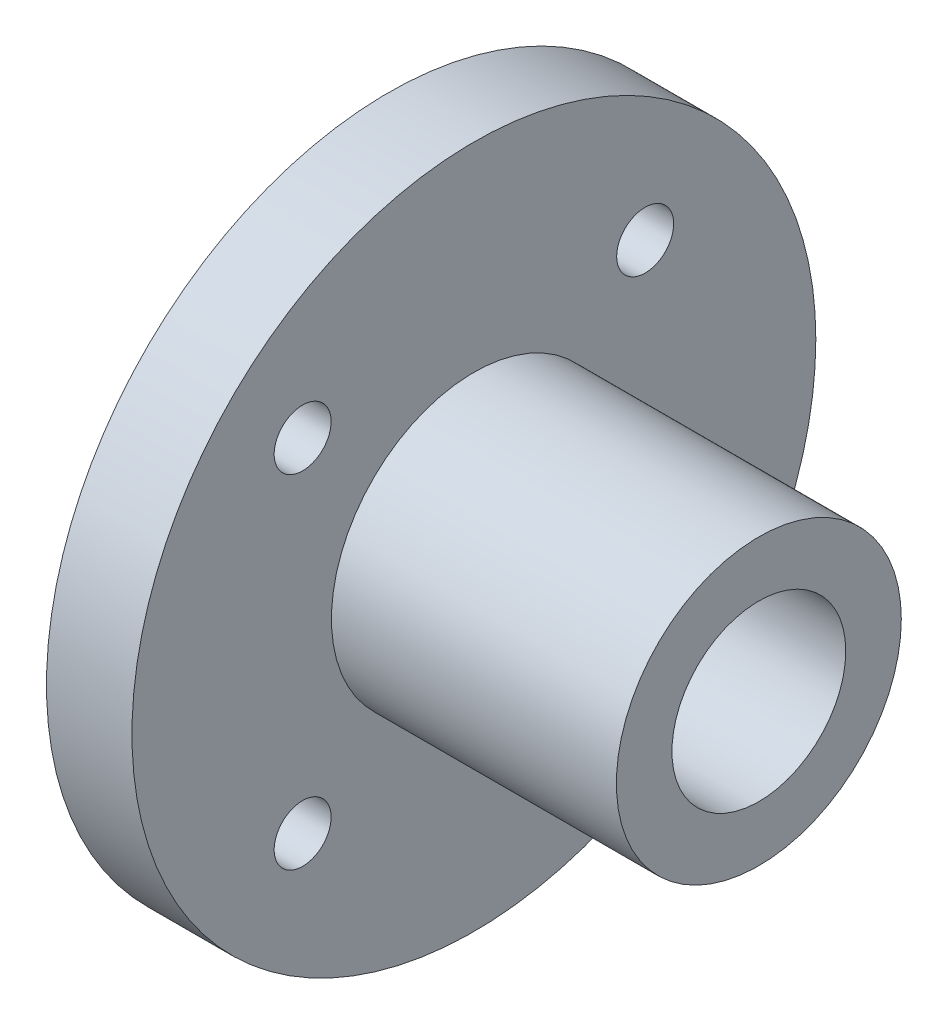
ISO-10303-21;
HEADER;
FILE_DESCRIPTION(('STEP AP214'),'2;1');
FILE_NAME('part.step','',(''),(''),'','','');
FILE_SCHEMA(('AUTOMOTIVE_DESIGN { 1 0 10303 214 1 1 1 1 }'));
ENDSEC;
DATA;
#1=APPLICATION_CONTEXT('core data for automotive mechanical design processes');
#2=APPLICATION_PROTOCOL_DEFINITION('international standard','automotive_design',2000,#1);
#3=PRODUCT_CONTEXT('',#1,'mechanical');
#4=PRODUCT('Part','Part','',(#3));
#5=PRODUCT_RELATED_PRODUCT_CATEGORY('part','',(#4));
#6=PRODUCT_DEFINITION_FORMATION('','',#4);
#7=PRODUCT_DEFINITION_CONTEXT('part definition',#1,'design');
#8=PRODUCT_DEFINITION('design','',#6,#7);
#9=PRODUCT_DEFINITION_SHAPE('','',#8);
#10=(LENGTH_UNIT() NAMED_UNIT(*) SI_UNIT(.MILLI.,.METRE.));
#11=(NAMED_UNIT(*) PLANE_ANGLE_UNIT() SI_UNIT($,.RADIAN.));
#12=(NAMED_UNIT(*) SI_UNIT($,.STERADIAN.) SOLID_ANGLE_UNIT());
#13=UNCERTAINTY_MEASURE_WITH_UNIT(LENGTH_MEASURE(1.E-05),#10,'distance_accuracy_value','');
#14=(GEOMETRIC_REPRESENTATION_CONTEXT(3) GLOBAL_UNCERTAINTY_ASSIGNED_CONTEXT((#13)) GLOBAL_UNIT_ASSIGNED_CONTEXT((#10,
#11,#12)) REPRESENTATION_CONTEXT('',''));
#15=CARTESIAN_POINT('',(0.,0.,0.));
#16=DIRECTION('',(0.,0.,1.));
#17=DIRECTION('',(1.,0.,0.));
#18=AXIS2_PLACEMENT_3D('',#15,#16,#17);
#19=CARTESIAN_POINT('',(-3.,0.,0.));
#20=DIRECTION('',(1.,0.,0.));
#21=DIRECTION('',(0.,0.,-1.));
#22=AXIS2_PLACEMENT_3D('',#19,#20,#21);
#23=CYLINDRICAL_SURFACE('',#22,12.);
#24=CARTESIAN_POINT('',(-3.,0.,0.));
#25=DIRECTION('',(1.,0.,0.));
#26=DIRECTION('',(0.,0.,-1.));
#27=AXIS2_PLACEMENT_3D('',#24,#25,#26);
#28=CIRCLE('',#27,12.);
#29=CARTESIAN_POINT('',(-3.,0.,-12.));
#30=VERTEX_POINT('',#29);
#31=EDGE_CURVE('E55',#30,#30,#28,.T.);
#32=ORIENTED_EDGE('',*,*,#31,.T.);
#33=EDGE_LOOP('',(#32));
#34=FACE_BOUND('',#33,.T.);
#35=CARTESIAN_POINT('',(0.,0.,0.));
#36=DIRECTION('',(1.,0.,0.));
#37=DIRECTION('',(0.,0.,-1.));
#38=AXIS2_PLACEMENT_3D('',#35,#36,#37);
#39=CIRCLE('',#38,12.);
#40=CARTESIAN_POINT('',(0.,0.,-12.));
#41=VERTEX_POINT('',#40);
#42=EDGE_CURVE('E60',#41,#41,#39,.T.);
#43=ORIENTED_EDGE('',*,*,#42,.F.);
#44=EDGE_LOOP('',(#43));
#45=FACE_BOUND('',#44,.T.);
#46=ADVANCED_FACE('F44',(#34,#45),#23,.T.);
#47=CARTESIAN_POINT('',(-3.,0.,0.));
#48=DIRECTION('',(1.,0.,0.));
#49=DIRECTION('',(0.,0.,-1.));
#50=AXIS2_PLACEMENT_3D('',#47,#48,#49);
#51=PLANE('',#50);
#52=CARTESIAN_POINT('',(-3.,-6.01040764008565,-6.01040764008565));
#53=DIRECTION('',(-1.,0.,0.));
#54=DIRECTION('',(0.,0.,1.));
#55=AXIS2_PLACEMENT_3D('',#52,#53,#54);
#56=CIRCLE('',#55,1.);
#57=CARTESIAN_POINT('',(-3.,-6.01040764008565,-5.01040764008565));
#58=VERTEX_POINT('',#57);
#59=EDGE_CURVE('E90',#58,#58,#56,.T.);
#60=ORIENTED_EDGE('',*,*,#59,.F.);
#61=EDGE_LOOP('',(#60));
#62=FACE_BOUND('',#61,.T.);
#63=CARTESIAN_POINT('',(-3.,6.01040764008565,6.01040764008566));
#64=DIRECTION('',(-1.,0.,0.));
#65=DIRECTION('',(0.,0.,1.));
#66=AXIS2_PLACEMENT_3D('',#63,#64,#65);
#67=CIRCLE('',#66,1.);
#68=CARTESIAN_POINT('',(-3.,6.01040764008565,7.01040764008566));
#69=VERTEX_POINT('',#68);
#70=EDGE_CURVE('E89',#69,#69,#67,.T.);
#71=ORIENTED_EDGE('',*,*,#70,.F.);
#72=EDGE_LOOP('',(#71));
#73=FACE_BOUND('',#72,.T.);
#74=CARTESIAN_POINT('',(-3.,-6.01040764008565,6.01040764008565));
#75=DIRECTION('',(-1.,0.,0.));
#76=DIRECTION('',(0.,0.,1.));
#77=AXIS2_PLACEMENT_3D('',#74,#75,#76);
#78=CIRCLE('',#77,1.);
#79=CARTESIAN_POINT('',(-3.,-6.01040764008565,7.01040764008565));
#80=VERTEX_POINT('',#79);
#81=EDGE_CURVE('E91',#80,#80,#78,.T.);
#82=ORIENTED_EDGE('',*,*,#81,.F.);
#83=EDGE_LOOP('',(#82));
#84=FACE_BOUND('',#83,.T.);
#85=CARTESIAN_POINT('',(-3.,6.01040764008566,-6.01040764008565));
#86=DIRECTION('',(-1.,0.,0.));
#87=DIRECTION('',(0.,0.,1.));
#88=AXIS2_PLACEMENT_3D('',#85,#86,#87);
#89=CIRCLE('',#88,1.);
#90=CARTESIAN_POINT('',(-3.,6.01040764008566,-5.01040764008565));
#91=VERTEX_POINT('',#90);
#92=EDGE_CURVE('E75',#91,#91,#89,.T.);
#93=ORIENTED_EDGE('',*,*,#92,.F.);
#94=EDGE_LOOP('',(#93));
#95=FACE_BOUND('',#94,.T.);
#96=CARTESIAN_POINT('',(-3.,0.,0.));
#97=DIRECTION('',(1.,0.,0.));
#98=DIRECTION('',(0.,0.,-1.));
#99=AXIS2_PLACEMENT_3D('',#96,#97,#98);
#100=CIRCLE('',#99,3.05);
#101=CARTESIAN_POINT('',(-3.,0.,-3.05));
#102=VERTEX_POINT('',#101);
#103=EDGE_CURVE('E65',#102,#102,#100,.T.);
#104=ORIENTED_EDGE('',*,*,#103,.T.);
#105=EDGE_LOOP('',(#104));
#106=FACE_BOUND('',#105,.T.);
#107=ORIENTED_EDGE('',*,*,#31,.F.);
#108=EDGE_LOOP('',(#107));
#109=FACE_BOUND('',#108,.T.);
#110=ADVANCED_FACE('F101',(#62,#73,#84,#95,#106,#109),#51,.F.);
#111=CARTESIAN_POINT('',(0.,0.,0.));
#112=DIRECTION('',(1.,0.,0.));
#113=DIRECTION('',(0.,0.,-1.));
#114=AXIS2_PLACEMENT_3D('',#111,#112,#113);
#115=PLANE('',#114);
#116=CARTESIAN_POINT('',(0.,-6.01040764008565,-6.01040764008565));
#117=DIRECTION('',(1.,0.,0.));
#118=DIRECTION('',(0.,0.,-1.));
#119=AXIS2_PLACEMENT_3D('',#116,#117,#118);
#120=CIRCLE('',#119,1.);
#121=CARTESIAN_POINT('',(0.,-6.01040764008565,-7.01040764008565));
#122=VERTEX_POINT('',#121);
#123=EDGE_CURVE('E48',#122,#122,#120,.T.);
#124=ORIENTED_EDGE('',*,*,#123,.F.);
#125=EDGE_LOOP('',(#124));
#126=FACE_BOUND('',#125,.T.);
#127=CARTESIAN_POINT('',(0.,6.01040764008565,6.01040764008566));
#128=DIRECTION('',(1.,0.,0.));
#129=DIRECTION('',(0.,0.,-1.));
#130=AXIS2_PLACEMENT_3D('',#127,#128,#129);
#131=CIRCLE('',#130,1.);
#132=CARTESIAN_POINT('',(0.,6.01040764008565,5.01040764008566));
#133=VERTEX_POINT('',#132);
#134=EDGE_CURVE('E74',#133,#133,#131,.T.);
#135=ORIENTED_EDGE('',*,*,#134,.F.);
#136=EDGE_LOOP('',(#135));
#137=FACE_BOUND('',#136,.T.);
#138=CARTESIAN_POINT('',(0.,-6.01040764008565,6.01040764008565));
#139=DIRECTION('',(1.,0.,0.));
#140=DIRECTION('',(0.,0.,-1.));
#141=AXIS2_PLACEMENT_3D('',#138,#139,#140);
#142=CIRCLE('',#141,1.);
#143=CARTESIAN_POINT('',(0.,-6.01040764008565,5.01040764008565));
#144=VERTEX_POINT('',#143);
#145=EDGE_CURVE('E72',#144,#144,#142,.T.);
#146=ORIENTED_EDGE('',*,*,#145,.F.);
#147=EDGE_LOOP('',(#146));
#148=FACE_BOUND('',#147,.T.);
#149=CARTESIAN_POINT('',(0.,6.01040764008566,-6.01040764008565));
#150=DIRECTION('',(1.,0.,0.));
#151=DIRECTION('',(0.,0.,-1.));
#152=AXIS2_PLACEMENT_3D('',#149,#150,#151);
#153=CIRCLE('',#152,1.);
#154=CARTESIAN_POINT('',(0.,6.01040764008566,-7.01040764008565));
#155=VERTEX_POINT('',#154);
#156=EDGE_CURVE('E70',#155,#155,#153,.T.);
#157=ORIENTED_EDGE('',*,*,#156,.F.);
#158=EDGE_LOOP('',(#157));
#159=FACE_BOUND('',#158,.T.);
#160=CARTESIAN_POINT('',(0.,0.,0.));
#161=DIRECTION('',(1.,0.,0.));
#162=DIRECTION('',(0.,0.,-1.));
#163=AXIS2_PLACEMENT_3D('',#160,#161,#162);
#164=CIRCLE('',#163,5.);
#165=CARTESIAN_POINT('',(0.,0.,-5.));
#166=VERTEX_POINT('',#165);
#167=EDGE_CURVE('E11',#166,#166,#164,.T.);
#168=ORIENTED_EDGE('',*,*,#167,.F.);
#169=EDGE_LOOP('',(#168));
#170=FACE_BOUND('',#169,.T.);
#171=ORIENTED_EDGE('',*,*,#42,.T.);
#172=EDGE_LOOP('',(#171));
#173=FACE_BOUND('',#172,.T.);
#174=ADVANCED_FACE('F102',(#126,#137,#148,#159,#170,#173),#115,.T.);
#175=CARTESIAN_POINT('',(-3.,0.,0.));
#176=DIRECTION('',(1.,0.,0.));
#177=DIRECTION('',(0.,0.,-1.));
#178=AXIS2_PLACEMENT_3D('',#175,#176,#177);
#179=CYLINDRICAL_SURFACE('',#178,3.05);
#180=ORIENTED_EDGE('',*,*,#103,.F.);
#181=EDGE_LOOP('',(#180));
#182=FACE_BOUND('',#181,.T.);
#183=CARTESIAN_POINT('',(10.,0.,0.));
#184=DIRECTION('',(1.,0.,0.));
#185=DIRECTION('',(0.,0.,-1.));
#186=AXIS2_PLACEMENT_3D('',#183,#184,#185);
#187=CIRCLE('',#186,3.05);
#188=CARTESIAN_POINT('',(10.,0.,-3.05));
#189=VERTEX_POINT('',#188);
#190=EDGE_CURVE('E78',#189,#189,#187,.T.);
#191=ORIENTED_EDGE('',*,*,#190,.T.);
#192=EDGE_LOOP('',(#191));
#193=FACE_BOUND('',#192,.T.);
#194=ADVANCED_FACE('F120',(#182,#193),#179,.F.);
#195=CARTESIAN_POINT('',(10.,0.,0.));
#196=DIRECTION('',(-1.,0.,0.));
#197=DIRECTION('',(0.,0.,1.));
#198=AXIS2_PLACEMENT_3D('',#195,#196,#197);
#199=CYLINDRICAL_SURFACE('',#198,5.);
#200=CARTESIAN_POINT('',(10.,0.,0.));
#201=DIRECTION('',(1.,0.,0.));
#202=DIRECTION('',(0.,0.,-1.));
#203=AXIS2_PLACEMENT_3D('',#200,#201,#202);
#204=CIRCLE('',#203,5.);
#205=CARTESIAN_POINT('',(10.,0.,-5.));
#206=VERTEX_POINT('',#205);
#207=EDGE_CURVE('E64',#206,#206,#204,.T.);
#208=ORIENTED_EDGE('',*,*,#207,.F.);
#209=EDGE_LOOP('',(#208));
#210=FACE_BOUND('',#209,.T.);
#211=ORIENTED_EDGE('',*,*,#167,.T.);
#212=EDGE_LOOP('',(#211));
#213=FACE_BOUND('',#212,.T.);
#214=ADVANCED_FACE('F121',(#210,#213),#199,.T.);
#215=CARTESIAN_POINT('',(10.,0.,0.));
#216=DIRECTION('',(1.,0.,0.));
#217=DIRECTION('',(0.,0.,-1.));
#218=AXIS2_PLACEMENT_3D('',#215,#216,#217);
#219=PLANE('',#218);
#220=ORIENTED_EDGE('',*,*,#190,.F.);
#221=EDGE_LOOP('',(#220));
#222=FACE_BOUND('',#221,.T.);
#223=ORIENTED_EDGE('',*,*,#207,.T.);
#224=EDGE_LOOP('',(#223));
#225=FACE_BOUND('',#224,.T.);
#226=ADVANCED_FACE('F134',(#222,#225),#219,.T.);
#227=CARTESIAN_POINT('',(7.,6.01040764008566,-6.01040764008565));
#228=DIRECTION('',(-1.,0.,0.));
#229=DIRECTION('',(0.,0.,1.));
#230=AXIS2_PLACEMENT_3D('',#227,#228,#229);
#231=CYLINDRICAL_SURFACE('',#230,1.);
#232=ORIENTED_EDGE('',*,*,#156,.T.);
#233=EDGE_LOOP('',(#232));
#234=FACE_BOUND('',#233,.T.);
#235=ORIENTED_EDGE('',*,*,#92,.T.);
#236=EDGE_LOOP('',(#235));
#237=FACE_BOUND('',#236,.T.);
#238=ADVANCED_FACE('F132',(#234,#237),#231,.F.);
#239=CARTESIAN_POINT('',(7.,-6.01040764008565,6.01040764008565));
#240=DIRECTION('',(-1.,0.,0.));
#241=DIRECTION('',(0.,0.,1.));
#242=AXIS2_PLACEMENT_3D('',#239,#240,#241);
#243=CYLINDRICAL_SURFACE('',#242,1.);
#244=ORIENTED_EDGE('',*,*,#145,.T.);
#245=EDGE_LOOP('',(#244));
#246=FACE_BOUND('',#245,.T.);
#247=ORIENTED_EDGE('',*,*,#81,.T.);
#248=EDGE_LOOP('',(#247));
#249=FACE_BOUND('',#248,.T.);
#250=ADVANCED_FACE('F97',(#246,#249),#243,.F.);
#251=CARTESIAN_POINT('',(7.,6.01040764008565,6.01040764008566));
#252=DIRECTION('',(-1.,0.,0.));
#253=DIRECTION('',(0.,0.,1.));
#254=AXIS2_PLACEMENT_3D('',#251,#252,#253);
#255=CYLINDRICAL_SURFACE('',#254,1.);
#256=ORIENTED_EDGE('',*,*,#134,.T.);
#257=EDGE_LOOP('',(#256));
#258=FACE_BOUND('',#257,.T.);
#259=ORIENTED_EDGE('',*,*,#70,.T.);
#260=EDGE_LOOP('',(#259));
#261=FACE_BOUND('',#260,.T.);
#262=ADVANCED_FACE('F136',(#258,#261),#255,.F.);
#263=CARTESIAN_POINT('',(7.,-6.01040764008565,-6.01040764008565));
#264=DIRECTION('',(-1.,0.,0.));
#265=DIRECTION('',(0.,0.,1.));
#266=AXIS2_PLACEMENT_3D('',#263,#264,#265);
#267=CYLINDRICAL_SURFACE('',#266,1.);
#268=ORIENTED_EDGE('',*,*,#123,.T.);
#269=EDGE_LOOP('',(#268));
#270=FACE_BOUND('',#269,.T.);
#271=ORIENTED_EDGE('',*,*,#59,.T.);
#272=EDGE_LOOP('',(#271));
#273=FACE_BOUND('',#272,.T.);
#274=ADVANCED_FACE('F142',(#270,#273),#267,.F.);
#275=CLOSED_SHELL('',(#46,#110,#174,#194,#214,#226,#238,#250,#262,#274));
#276=MANIFOLD_SOLID_BREP('B2',#275);
#277=ADVANCED_BREP_SHAPE_REPRESENTATION('',(#18,#276),#14);
#278=SHAPE_DEFINITION_REPRESENTATION(#9,#277);
ENDSEC;
END-ISO-10303-21;
